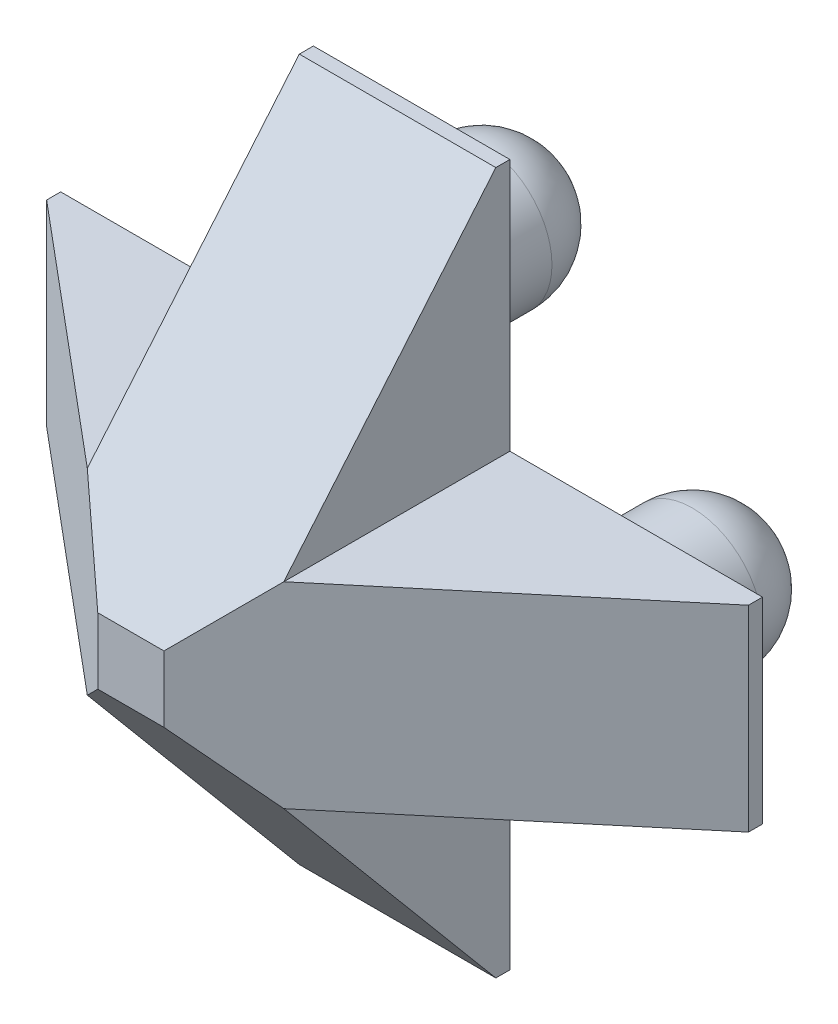
ISO-10303-21;
HEADER;
FILE_DESCRIPTION(('STEP AP214'),'2;1');
FILE_NAME('part.step','',(''),(''),'','','');
FILE_SCHEMA(('AUTOMOTIVE_DESIGN { 1 0 10303 214 1 1 1 1 }'));
ENDSEC;
DATA;
#1=APPLICATION_CONTEXT('core data for automotive mechanical design processes');
#2=APPLICATION_PROTOCOL_DEFINITION('international standard','automotive_design',2000,#1);
#3=PRODUCT_CONTEXT('',#1,'mechanical');
#4=PRODUCT('Part','Part','',(#3));
#5=PRODUCT_RELATED_PRODUCT_CATEGORY('part','',(#4));
#6=PRODUCT_DEFINITION_FORMATION('','',#4);
#7=PRODUCT_DEFINITION_CONTEXT('part definition',#1,'design');
#8=PRODUCT_DEFINITION('design','',#6,#7);
#9=PRODUCT_DEFINITION_SHAPE('','',#8);
#10=(LENGTH_UNIT() NAMED_UNIT(*) SI_UNIT(.MILLI.,.METRE.));
#11=(NAMED_UNIT(*) PLANE_ANGLE_UNIT() SI_UNIT($,.RADIAN.));
#12=(NAMED_UNIT(*) SI_UNIT($,.STERADIAN.) SOLID_ANGLE_UNIT());
#13=UNCERTAINTY_MEASURE_WITH_UNIT(LENGTH_MEASURE(1.E-05),#10,'distance_accuracy_value','');
#14=(GEOMETRIC_REPRESENTATION_CONTEXT(3) GLOBAL_UNCERTAINTY_ASSIGNED_CONTEXT((#13)) GLOBAL_UNIT_ASSIGNED_CONTEXT((#10,
#11,#12)) REPRESENTATION_CONTEXT('',''));
#15=CARTESIAN_POINT('',(0.,0.,0.));
#16=DIRECTION('',(0.,0.,1.));
#17=DIRECTION('',(1.,0.,0.));
#18=AXIS2_PLACEMENT_3D('',#15,#16,#17);
#19=CARTESIAN_POINT('',(22.86,63.5,25.4));
#20=DIRECTION('',(1.,0.,0.));
#21=DIRECTION('',(0.,0.,-1.));
#22=AXIS2_PLACEMENT_3D('',#19,#20,#21);
#23=PLANE('',#22);
#24=DIRECTION('',(0.,0.,-1.));
#25=VECTOR('',#24,1.);
#26=CARTESIAN_POINT('',(22.86,40.64,25.4));
#27=LINE('',#26,#25);
#28=CARTESIAN_POINT('',(22.86,40.64,20.4518175687126));
#29=VERTEX_POINT('',#28);
#30=CARTESIAN_POINT('',(22.86,40.64,0.));
#31=VERTEX_POINT('',#30);
#32=EDGE_CURVE('E143',#29,#31,#27,.T.);
#33=ORIENTED_EDGE('',*,*,#32,.F.);
#34=DIRECTION('',(0.,0.766044443118977,-0.642787609686541));
#35=VECTOR('',#34,1.);
#36=CARTESIAN_POINT('',(22.86,34.7429858107017,25.4));
#37=LINE('',#36,#35);
#38=CARTESIAN_POINT('',(22.86,63.5,1.26999999999992));
#39=VERTEX_POINT('',#38);
#40=EDGE_CURVE('E65',#29,#39,#37,.T.);
#41=ORIENTED_EDGE('',*,*,#40,.T.);
#42=DIRECTION('',(0.,0.,-1.));
#43=VECTOR('',#42,1.);
#44=CARTESIAN_POINT('',(22.86,63.5,25.4));
#45=LINE('',#44,#43);
#46=CARTESIAN_POINT('',(22.86,63.5,0.));
#47=VERTEX_POINT('',#46);
#48=EDGE_CURVE('E166',#39,#47,#45,.T.);
#49=ORIENTED_EDGE('',*,*,#48,.T.);
#50=DIRECTION('',(0.,-1.,0.));
#51=VECTOR('',#50,1.);
#52=CARTESIAN_POINT('',(22.86,63.5,0.));
#53=LINE('',#52,#51);
#54=EDGE_CURVE('E160',#47,#31,#53,.T.);
#55=ORIENTED_EDGE('',*,*,#54,.T.);
#56=EDGE_LOOP('',(#33,#41,#49,#55));
#57=FACE_BOUND('',#56,.T.);
#58=ADVANCED_FACE('F41',(#57),#23,.F.);
#59=CARTESIAN_POINT('',(0.,40.64,25.4));
#60=DIRECTION('',(0.,-1.,0.));
#61=DIRECTION('',(0.,0.,-1.));
#62=AXIS2_PLACEMENT_3D('',#59,#60,#61);
#63=PLANE('',#62);
#64=DIRECTION('',(0.,0.,-1.));
#65=VECTOR('',#64,1.);
#66=CARTESIAN_POINT('',(0.,40.64,25.4));
#67=LINE('',#66,#65);
#68=CARTESIAN_POINT('',(0.,40.64,1.26999999999993));
#69=VERTEX_POINT('',#68);
#70=CARTESIAN_POINT('',(0.,40.64,0.));
#71=VERTEX_POINT('',#70);
#72=EDGE_CURVE('E154',#69,#71,#67,.T.);
#73=ORIENTED_EDGE('',*,*,#72,.F.);
#74=DIRECTION('',(0.766044443118977,0.,0.642787609686541));
#75=VECTOR('',#74,1.);
#76=CARTESIAN_POINT('',(28.7570141892983,40.64,25.4));
#77=LINE('',#76,#75);
#78=EDGE_CURVE('E150',#69,#29,#77,.T.);
#79=ORIENTED_EDGE('',*,*,#78,.T.);
#80=ORIENTED_EDGE('',*,*,#32,.T.);
#81=DIRECTION('',(-1.,0.,0.));
#82=VECTOR('',#81,1.);
#83=CARTESIAN_POINT('',(0.,40.64,0.));
#84=LINE('',#83,#82);
#85=EDGE_CURVE('E147',#31,#71,#84,.T.);
#86=ORIENTED_EDGE('',*,*,#85,.T.);
#87=EDGE_LOOP('',(#73,#79,#80,#86));
#88=FACE_BOUND('',#87,.T.);
#89=ADVANCED_FACE('F146',(#88),#63,.F.);
#90=CARTESIAN_POINT('',(0.,22.86,25.4));
#91=DIRECTION('',(1.,0.,0.));
#92=DIRECTION('',(0.,1.,0.));
#93=AXIS2_PLACEMENT_3D('',#90,#91,#92);
#94=PLANE('',#93);
#95=DIRECTION('',(0.,0.,-1.));
#96=VECTOR('',#95,1.);
#97=CARTESIAN_POINT('',(0.,22.86,25.4));
#98=LINE('',#97,#96);
#99=CARTESIAN_POINT('',(0.,22.86,1.26999999999993));
#100=VERTEX_POINT('',#99);
#101=CARTESIAN_POINT('',(0.,22.86,0.));
#102=VERTEX_POINT('',#101);
#103=EDGE_CURVE('E239',#100,#102,#98,.T.);
#104=ORIENTED_EDGE('',*,*,#103,.F.);
#105=DIRECTION('',(0.,1.,0.));
#106=VECTOR('',#105,1.);
#107=CARTESIAN_POINT('',(0.,40.64,1.26999999999994));
#108=LINE('',#107,#106);
#109=EDGE_CURVE('E278',#100,#69,#108,.T.);
#110=ORIENTED_EDGE('',*,*,#109,.T.);
#111=ORIENTED_EDGE('',*,*,#72,.T.);
#112=DIRECTION('',(0.,-1.,0.));
#113=VECTOR('',#112,1.);
#114=CARTESIAN_POINT('',(0.,22.86,0.));
#115=LINE('',#114,#113);
#116=EDGE_CURVE('E163',#71,#102,#115,.T.);
#117=ORIENTED_EDGE('',*,*,#116,.T.);
#118=EDGE_LOOP('',(#104,#110,#111,#117));
#119=FACE_BOUND('',#118,.T.);
#120=ADVANCED_FACE('F346',(#119),#94,.F.);
#121=CARTESIAN_POINT('',(0.,22.86,25.4));
#122=DIRECTION('',(0.,1.,0.));
#123=DIRECTION('',(0.,0.,1.));
#124=AXIS2_PLACEMENT_3D('',#121,#122,#123);
#125=PLANE('',#124);
#126=DIRECTION('',(0.,0.,-1.));
#127=VECTOR('',#126,1.);
#128=CARTESIAN_POINT('',(22.86,22.86,25.4));
#129=LINE('',#128,#127);
#130=CARTESIAN_POINT('',(22.86,22.86,20.4518175687126));
#131=VERTEX_POINT('',#130);
#132=CARTESIAN_POINT('',(22.86,22.86,0.));
#133=VERTEX_POINT('',#132);
#134=EDGE_CURVE('E236',#131,#133,#129,.T.);
#135=ORIENTED_EDGE('',*,*,#134,.F.);
#136=DIRECTION('',(-0.766044443118977,0.,-0.642787609686541));
#137=VECTOR('',#136,1.);
#138=CARTESIAN_POINT('',(28.7570141892983,22.86,25.4));
#139=LINE('',#138,#137);
#140=EDGE_CURVE('E275',#131,#100,#139,.T.);
#141=ORIENTED_EDGE('',*,*,#140,.T.);
#142=ORIENTED_EDGE('',*,*,#103,.T.);
#143=DIRECTION('',(1.,0.,0.));
#144=VECTOR('',#143,1.);
#145=CARTESIAN_POINT('',(0.,22.86,0.));
#146=LINE('',#145,#144);
#147=EDGE_CURVE('E178',#102,#133,#146,.T.);
#148=ORIENTED_EDGE('',*,*,#147,.T.);
#149=EDGE_LOOP('',(#135,#141,#142,#148));
#150=FACE_BOUND('',#149,.T.);
#151=ADVANCED_FACE('F436',(#150),#125,.F.);
#152=CARTESIAN_POINT('',(22.86,0.,25.4));
#153=DIRECTION('',(1.,0.,0.));
#154=DIRECTION('',(0.,0.,-1.));
#155=AXIS2_PLACEMENT_3D('',#152,#153,#154);
#156=PLANE('',#155);
#157=DIRECTION('',(0.,0.,-1.));
#158=VECTOR('',#157,1.);
#159=CARTESIAN_POINT('',(22.86,0.,25.4));
#160=LINE('',#159,#158);
#161=CARTESIAN_POINT('',(22.86,0.,1.26999999999994));
#162=VERTEX_POINT('',#161);
#163=CARTESIAN_POINT('',(22.86,0.,0.));
#164=VERTEX_POINT('',#163);
#165=EDGE_CURVE('E233',#162,#164,#160,.T.);
#166=ORIENTED_EDGE('',*,*,#165,.F.);
#167=DIRECTION('',(0.,0.766044443118977,0.642787609686541));
#168=VECTOR('',#167,1.);
#169=CARTESIAN_POINT('',(22.86,28.7570141892983,25.4));
#170=LINE('',#169,#168);
#171=EDGE_CURVE('E263',#162,#131,#170,.T.);
#172=ORIENTED_EDGE('',*,*,#171,.T.);
#173=ORIENTED_EDGE('',*,*,#134,.T.);
#174=DIRECTION('',(0.,-1.,0.));
#175=VECTOR('',#174,1.);
#176=CARTESIAN_POINT('',(22.86,0.,0.));
#177=LINE('',#176,#175);
#178=EDGE_CURVE('E182',#133,#164,#177,.T.);
#179=ORIENTED_EDGE('',*,*,#178,.T.);
#180=EDGE_LOOP('',(#166,#172,#173,#179));
#181=FACE_BOUND('',#180,.T.);
#182=ADVANCED_FACE('F432',(#181),#156,.F.);
#183=CARTESIAN_POINT('',(22.86,0.,25.4));
#184=DIRECTION('',(0.,1.,0.));
#185=DIRECTION('',(-1.,0.,0.));
#186=AXIS2_PLACEMENT_3D('',#183,#184,#185);
#187=PLANE('',#186);
#188=DIRECTION('',(0.,0.,-1.));
#189=VECTOR('',#188,1.);
#190=CARTESIAN_POINT('',(40.64,0.,25.4));
#191=LINE('',#190,#189);
#192=CARTESIAN_POINT('',(40.64,0.,1.26999999999994));
#193=VERTEX_POINT('',#192);
#194=CARTESIAN_POINT('',(40.64,0.,0.));
#195=VERTEX_POINT('',#194);
#196=EDGE_CURVE('E230',#193,#195,#191,.T.);
#197=ORIENTED_EDGE('',*,*,#196,.F.);
#198=DIRECTION('',(-1.,0.,0.));
#199=VECTOR('',#198,1.);
#200=CARTESIAN_POINT('',(22.86,0.,1.26999999999994));
#201=LINE('',#200,#199);
#202=EDGE_CURVE('E259',#193,#162,#201,.T.);
#203=ORIENTED_EDGE('',*,*,#202,.T.);
#204=ORIENTED_EDGE('',*,*,#165,.T.);
#205=DIRECTION('',(1.,0.,0.));
#206=VECTOR('',#205,1.);
#207=CARTESIAN_POINT('',(22.86,0.,0.));
#208=LINE('',#207,#206);
#209=EDGE_CURVE('E186',#164,#195,#208,.T.);
#210=ORIENTED_EDGE('',*,*,#209,.T.);
#211=EDGE_LOOP('',(#197,#203,#204,#210));
#212=FACE_BOUND('',#211,.T.);
#213=ADVANCED_FACE('F428',(#212),#187,.F.);
#214=CARTESIAN_POINT('',(40.64,0.,25.4));
#215=DIRECTION('',(-1.,0.,0.));
#216=DIRECTION('',(0.,0.,1.));
#217=AXIS2_PLACEMENT_3D('',#214,#215,#216);
#218=PLANE('',#217);
#219=DIRECTION('',(0.,0.,-1.));
#220=VECTOR('',#219,1.);
#221=CARTESIAN_POINT('',(40.64,22.86,25.4));
#222=LINE('',#221,#220);
#223=CARTESIAN_POINT('',(40.64,22.86,20.4518175687126));
#224=VERTEX_POINT('',#223);
#225=CARTESIAN_POINT('',(40.64,22.86,0.));
#226=VERTEX_POINT('',#225);
#227=EDGE_CURVE('E227',#224,#226,#222,.T.);
#228=ORIENTED_EDGE('',*,*,#227,.F.);
#229=DIRECTION('',(0.,-0.766044443118977,-0.642787609686541));
#230=VECTOR('',#229,1.);
#231=CARTESIAN_POINT('',(40.64,28.7570141892983,25.4));
#232=LINE('',#231,#230);
#233=EDGE_CURVE('E256',#224,#193,#232,.T.);
#234=ORIENTED_EDGE('',*,*,#233,.T.);
#235=ORIENTED_EDGE('',*,*,#196,.T.);
#236=DIRECTION('',(0.,1.,0.));
#237=VECTOR('',#236,1.);
#238=CARTESIAN_POINT('',(40.64,0.,0.));
#239=LINE('',#238,#237);
#240=EDGE_CURVE('E190',#195,#226,#239,.T.);
#241=ORIENTED_EDGE('',*,*,#240,.T.);
#242=EDGE_LOOP('',(#228,#234,#235,#241));
#243=FACE_BOUND('',#242,.T.);
#244=ADVANCED_FACE('F424',(#243),#218,.F.);
#245=CARTESIAN_POINT('',(63.5,22.86,25.4));
#246=DIRECTION('',(0.,1.,0.));
#247=DIRECTION('',(-1.,0.,0.));
#248=AXIS2_PLACEMENT_3D('',#245,#246,#247);
#249=PLANE('',#248);
#250=DIRECTION('',(0.,0.,-1.));
#251=VECTOR('',#250,1.);
#252=CARTESIAN_POINT('',(63.5,22.86,25.4));
#253=LINE('',#252,#251);
#254=CARTESIAN_POINT('',(63.5,22.86,1.26999999999994));
#255=VERTEX_POINT('',#254);
#256=CARTESIAN_POINT('',(63.5,22.86,0.));
#257=VERTEX_POINT('',#256);
#258=EDGE_CURVE('E224',#255,#257,#253,.T.);
#259=ORIENTED_EDGE('',*,*,#258,.F.);
#260=DIRECTION('',(-0.766044443118977,0.,0.642787609686541));
#261=VECTOR('',#260,1.);
#262=CARTESIAN_POINT('',(34.7429858107017,22.86,25.4));
#263=LINE('',#262,#261);
#264=EDGE_CURVE('E272',#255,#224,#263,.T.);
#265=ORIENTED_EDGE('',*,*,#264,.T.);
#266=ORIENTED_EDGE('',*,*,#227,.T.);
#267=DIRECTION('',(1.,0.,0.));
#268=VECTOR('',#267,1.);
#269=CARTESIAN_POINT('',(63.5,22.86,0.));
#270=LINE('',#269,#268);
#271=EDGE_CURVE('E194',#226,#257,#270,.T.);
#272=ORIENTED_EDGE('',*,*,#271,.T.);
#273=EDGE_LOOP('',(#259,#265,#266,#272));
#274=FACE_BOUND('',#273,.T.);
#275=ADVANCED_FACE('F420',(#274),#249,.F.);
#276=CARTESIAN_POINT('',(63.5,22.86,25.4));
#277=DIRECTION('',(-1.,0.,0.));
#278=DIRECTION('',(0.,0.,1.));
#279=AXIS2_PLACEMENT_3D('',#276,#277,#278);
#280=PLANE('',#279);
#281=DIRECTION('',(0.,0.,-1.));
#282=VECTOR('',#281,1.);
#283=CARTESIAN_POINT('',(63.5,40.64,25.4));
#284=LINE('',#283,#282);
#285=CARTESIAN_POINT('',(63.5,40.64,1.26999999999994));
#286=VERTEX_POINT('',#285);
#287=CARTESIAN_POINT('',(63.5,40.64,0.));
#288=VERTEX_POINT('',#287);
#289=EDGE_CURVE('E221',#286,#288,#284,.T.);
#290=ORIENTED_EDGE('',*,*,#289,.F.);
#291=DIRECTION('',(0.,-1.,0.));
#292=VECTOR('',#291,1.);
#293=CARTESIAN_POINT('',(63.5,22.86,1.26999999999994));
#294=LINE('',#293,#292);
#295=EDGE_CURVE('E269',#286,#255,#294,.T.);
#296=ORIENTED_EDGE('',*,*,#295,.T.);
#297=ORIENTED_EDGE('',*,*,#258,.T.);
#298=DIRECTION('',(0.,1.,0.));
#299=VECTOR('',#298,1.);
#300=CARTESIAN_POINT('',(63.5,22.86,0.));
#301=LINE('',#300,#299);
#302=EDGE_CURVE('E198',#257,#288,#301,.T.);
#303=ORIENTED_EDGE('',*,*,#302,.T.);
#304=EDGE_LOOP('',(#290,#296,#297,#303));
#305=FACE_BOUND('',#304,.T.);
#306=ADVANCED_FACE('F416',(#305),#280,.F.);
#307=CARTESIAN_POINT('',(63.5,40.64,25.4));
#308=DIRECTION('',(0.,-1.,0.));
#309=DIRECTION('',(0.,0.,-1.));
#310=AXIS2_PLACEMENT_3D('',#307,#308,#309);
#311=PLANE('',#310);
#312=DIRECTION('',(0.,0.,-1.));
#313=VECTOR('',#312,1.);
#314=CARTESIAN_POINT('',(40.64,40.64,25.4));
#315=LINE('',#314,#313);
#316=CARTESIAN_POINT('',(40.64,40.64,20.4518175687126));
#317=VERTEX_POINT('',#316);
#318=CARTESIAN_POINT('',(40.64,40.64,0.));
#319=VERTEX_POINT('',#318);
#320=EDGE_CURVE('E218',#317,#319,#315,.T.);
#321=ORIENTED_EDGE('',*,*,#320,.F.);
#322=DIRECTION('',(0.766044443118977,0.,-0.642787609686541));
#323=VECTOR('',#322,1.);
#324=CARTESIAN_POINT('',(34.7429858107017,40.64,25.4));
#325=LINE('',#324,#323);
#326=EDGE_CURVE('E266',#317,#286,#325,.T.);
#327=ORIENTED_EDGE('',*,*,#326,.T.);
#328=ORIENTED_EDGE('',*,*,#289,.T.);
#329=DIRECTION('',(-1.,0.,0.));
#330=VECTOR('',#329,1.);
#331=CARTESIAN_POINT('',(63.5,40.64,0.));
#332=LINE('',#331,#330);
#333=EDGE_CURVE('E202',#288,#319,#332,.T.);
#334=ORIENTED_EDGE('',*,*,#333,.T.);
#335=EDGE_LOOP('',(#321,#327,#328,#334));
#336=FACE_BOUND('',#335,.T.);
#337=ADVANCED_FACE('F412',(#336),#311,.F.);
#338=CARTESIAN_POINT('',(40.64,63.5,25.4));
#339=DIRECTION('',(-1.,0.,0.));
#340=DIRECTION('',(0.,0.,1.));
#341=AXIS2_PLACEMENT_3D('',#338,#339,#340);
#342=PLANE('',#341);
#343=DIRECTION('',(0.,0.,-1.));
#344=VECTOR('',#343,1.);
#345=CARTESIAN_POINT('',(40.64,63.5,25.4));
#346=LINE('',#345,#344);
#347=CARTESIAN_POINT('',(40.64,63.5,1.26999999999992));
#348=VERTEX_POINT('',#347);
#349=CARTESIAN_POINT('',(40.64,63.5,0.));
#350=VERTEX_POINT('',#349);
#351=EDGE_CURVE('E215',#348,#350,#346,.T.);
#352=ORIENTED_EDGE('',*,*,#351,.F.);
#353=DIRECTION('',(0.,-0.766044443118977,0.642787609686541));
#354=VECTOR('',#353,1.);
#355=CARTESIAN_POINT('',(40.64,34.7429858107017,25.4));
#356=LINE('',#355,#354);
#357=EDGE_CURVE('E287',#348,#317,#356,.T.);
#358=ORIENTED_EDGE('',*,*,#357,.T.);
#359=ORIENTED_EDGE('',*,*,#320,.T.);
#360=DIRECTION('',(0.,1.,0.));
#361=VECTOR('',#360,1.);
#362=CARTESIAN_POINT('',(40.64,63.5,0.));
#363=LINE('',#362,#361);
#364=EDGE_CURVE('E206',#319,#350,#363,.T.);
#365=ORIENTED_EDGE('',*,*,#364,.T.);
#366=EDGE_LOOP('',(#352,#358,#359,#365));
#367=FACE_BOUND('',#366,.T.);
#368=ADVANCED_FACE('F409',(#367),#342,.F.);
#369=CARTESIAN_POINT('',(22.86,63.5,25.4));
#370=DIRECTION('',(0.,-1.,0.));
#371=DIRECTION('',(0.,0.,-1.));
#372=AXIS2_PLACEMENT_3D('',#369,#370,#371);
#373=PLANE('',#372);
#374=ORIENTED_EDGE('',*,*,#48,.F.);
#375=DIRECTION('',(1.,0.,0.));
#376=VECTOR('',#375,1.);
#377=CARTESIAN_POINT('',(40.64,63.5,1.26999999999993));
#378=LINE('',#377,#376);
#379=EDGE_CURVE('E57',#39,#348,#378,.T.);
#380=ORIENTED_EDGE('',*,*,#379,.T.);
#381=ORIENTED_EDGE('',*,*,#351,.T.);
#382=DIRECTION('',(-1.,0.,0.));
#383=VECTOR('',#382,1.);
#384=CARTESIAN_POINT('',(22.86,63.5,0.));
#385=LINE('',#384,#383);
#386=EDGE_CURVE('E210',#350,#47,#385,.T.);
#387=ORIENTED_EDGE('',*,*,#386,.T.);
#388=EDGE_LOOP('',(#374,#380,#381,#387));
#389=FACE_BOUND('',#388,.T.);
#390=ADVANCED_FACE('F401',(#389),#373,.F.);
#391=CARTESIAN_POINT('',(0.,0.,25.4));
#392=DIRECTION('',(0.,0.,1.));
#393=DIRECTION('',(1.,0.,0.));
#394=AXIS2_PLACEMENT_3D('',#391,#392,#393);
#395=PLANE('',#394);
#396=DIRECTION('',(0.,-1.,0.));
#397=VECTOR('',#396,1.);
#398=CARTESIAN_POINT('',(28.7570141892983,22.86,25.4));
#399=LINE('',#398,#397);
#400=CARTESIAN_POINT('',(28.7570141892983,34.7429858107017,25.4));
#401=VERTEX_POINT('',#400);
#402=CARTESIAN_POINT('',(28.7570141892983,28.7570141892983,25.4));
#403=VERTEX_POINT('',#402);
#404=EDGE_CURVE('E246',#401,#403,#399,.T.);
#405=ORIENTED_EDGE('',*,*,#404,.T.);
#406=DIRECTION('',(1.,0.,0.));
#407=VECTOR('',#406,1.);
#408=CARTESIAN_POINT('',(40.64,28.7570141892983,25.4));
#409=LINE('',#408,#407);
#410=CARTESIAN_POINT('',(34.7429858107017,28.7570141892983,25.4));
#411=VERTEX_POINT('',#410);
#412=EDGE_CURVE('E252',#403,#411,#409,.T.);
#413=ORIENTED_EDGE('',*,*,#412,.T.);
#414=DIRECTION('',(0.,1.,0.));
#415=VECTOR('',#414,1.);
#416=CARTESIAN_POINT('',(34.7429858107017,40.64,25.4));
#417=LINE('',#416,#415);
#418=CARTESIAN_POINT('',(34.7429858107017,34.7429858107017,25.4));
#419=VERTEX_POINT('',#418);
#420=EDGE_CURVE('E249',#411,#419,#417,.T.);
#421=ORIENTED_EDGE('',*,*,#420,.T.);
#422=DIRECTION('',(-1.,0.,0.));
#423=VECTOR('',#422,1.);
#424=CARTESIAN_POINT('',(22.86,34.7429858107017,25.4));
#425=LINE('',#424,#423);
#426=EDGE_CURVE('E153',#419,#401,#425,.T.);
#427=ORIENTED_EDGE('',*,*,#426,.T.);
#428=EDGE_LOOP('',(#405,#413,#421,#427));
#429=FACE_BOUND('',#428,.T.);
#430=ADVANCED_FACE('F395',(#429),#395,.T.);
#431=CARTESIAN_POINT('',(0.,0.,0.));
#432=DIRECTION('',(0.,0.,1.));
#433=DIRECTION('',(1.,0.,0.));
#434=AXIS2_PLACEMENT_3D('',#431,#432,#433);
#435=PLANE('',#434);
#436=CARTESIAN_POINT('',(31.75,50.8,0.));
#437=DIRECTION('',(0.,0.,1.));
#438=DIRECTION('',(1.,0.,0.));
#439=AXIS2_PLACEMENT_3D('',#436,#437,#438);
#440=CIRCLE('',#439,6.35);
#441=CARTESIAN_POINT('',(38.1,50.8,0.));
#442=VERTEX_POINT('',#441);
#443=EDGE_CURVE('E312',#442,#442,#440,.F.);
#444=ORIENTED_EDGE('',*,*,#443,.F.);
#445=EDGE_LOOP('',(#444));
#446=FACE_BOUND('',#445,.T.);
#447=CARTESIAN_POINT('',(31.75,12.7,0.));
#448=DIRECTION('',(0.,0.,1.));
#449=DIRECTION('',(1.,0.,0.));
#450=AXIS2_PLACEMENT_3D('',#447,#448,#449);
#451=CIRCLE('',#450,6.35);
#452=CARTESIAN_POINT('',(38.1,12.7,0.));
#453=VERTEX_POINT('',#452);
#454=EDGE_CURVE('E308',#453,#453,#451,.F.);
#455=ORIENTED_EDGE('',*,*,#454,.F.);
#456=EDGE_LOOP('',(#455));
#457=FACE_BOUND('',#456,.T.);
#458=CARTESIAN_POINT('',(12.7,31.75,0.));
#459=DIRECTION('',(0.,0.,1.));
#460=DIRECTION('',(1.,0.,0.));
#461=AXIS2_PLACEMENT_3D('',#458,#459,#460);
#462=CIRCLE('',#461,6.35);
#463=CARTESIAN_POINT('',(19.05,31.75,0.));
#464=VERTEX_POINT('',#463);
#465=EDGE_CURVE('E304',#464,#464,#462,.F.);
#466=ORIENTED_EDGE('',*,*,#465,.F.);
#467=EDGE_LOOP('',(#466));
#468=FACE_BOUND('',#467,.T.);
#469=CARTESIAN_POINT('',(50.8,31.75,0.));
#470=DIRECTION('',(0.,0.,1.));
#471=DIRECTION('',(1.,0.,0.));
#472=AXIS2_PLACEMENT_3D('',#469,#470,#471);
#473=CIRCLE('',#472,6.35);
#474=CARTESIAN_POINT('',(57.15,31.75,0.));
#475=VERTEX_POINT('',#474);
#476=EDGE_CURVE('E290',#475,#475,#473,.F.);
#477=ORIENTED_EDGE('',*,*,#476,.F.);
#478=EDGE_LOOP('',(#477));
#479=FACE_BOUND('',#478,.T.);
#480=ORIENTED_EDGE('',*,*,#54,.F.);
#481=ORIENTED_EDGE('',*,*,#386,.F.);
#482=ORIENTED_EDGE('',*,*,#364,.F.);
#483=ORIENTED_EDGE('',*,*,#333,.F.);
#484=ORIENTED_EDGE('',*,*,#302,.F.);
#485=ORIENTED_EDGE('',*,*,#271,.F.);
#486=ORIENTED_EDGE('',*,*,#240,.F.);
#487=ORIENTED_EDGE('',*,*,#209,.F.);
#488=ORIENTED_EDGE('',*,*,#178,.F.);
#489=ORIENTED_EDGE('',*,*,#147,.F.);
#490=ORIENTED_EDGE('',*,*,#116,.F.);
#491=ORIENTED_EDGE('',*,*,#85,.F.);
#492=EDGE_LOOP('',(#480,#481,#482,#483,#484,#485,#486,#487,#488,#489,#490,#491));
#493=FACE_BOUND('',#492,.T.);
#494=ADVANCED_FACE('F158',(#446,#457,#468,#479,#493),#435,.F.);
#495=CARTESIAN_POINT('',(0.,34.7429858107017,25.4));
#496=DIRECTION('',(0.,0.642787609686541,0.766044443118977));
#497=DIRECTION('',(1.,0.,0.));
#498=AXIS2_PLACEMENT_3D('',#495,#496,#497);
#499=PLANE('',#498);
#500=ORIENTED_EDGE('',*,*,#379,.F.);
#501=ORIENTED_EDGE('',*,*,#40,.F.);
#502=DIRECTION('',(-0.608120402411342,0.608120402411342,-0.510273605374738));
#503=VECTOR('',#502,1.);
#504=CARTESIAN_POINT('',(41.6053324970365,21.8946675029635,36.1810191532715));
#505=LINE('',#504,#503);
#506=EDGE_CURVE('E169',#401,#29,#505,.T.);
#507=ORIENTED_EDGE('',*,*,#506,.F.);
#508=ORIENTED_EDGE('',*,*,#426,.F.);
#509=DIRECTION('',(0.608120402411343,0.608120402411342,-0.510273605374738));
#510=VECTOR('',#509,1.);
#511=CARTESIAN_POINT('',(21.8946675029635,21.8946675029635,36.1810191532715));
#512=LINE('',#511,#510);
#513=EDGE_CURVE('E173',#317,#419,#512,.F.);
#514=ORIENTED_EDGE('',*,*,#513,.F.);
#515=ORIENTED_EDGE('',*,*,#357,.F.);
#516=EDGE_LOOP('',(#500,#501,#507,#508,#514,#515));
#517=FACE_BOUND('',#516,.T.);
#518=ADVANCED_FACE('F372',(#517),#499,.T.);
#519=CARTESIAN_POINT('',(28.7570141892983,0.,25.4));
#520=DIRECTION('',(-0.64278760968654,0.,0.766044443118977));
#521=DIRECTION('',(0.,1.,0.));
#522=AXIS2_PLACEMENT_3D('',#519,#520,#521);
#523=PLANE('',#522);
#524=ORIENTED_EDGE('',*,*,#109,.F.);
#525=ORIENTED_EDGE('',*,*,#140,.F.);
#526=DIRECTION('',(-0.608120402411342,-0.608120402411342,-0.510273605374738));
#527=VECTOR('',#526,1.);
#528=CARTESIAN_POINT('',(18.1223705838992,18.1223705838992,16.4764744730078));
#529=LINE('',#528,#527);
#530=EDGE_CURVE('E294',#403,#131,#529,.T.);
#531=ORIENTED_EDGE('',*,*,#530,.F.);
#532=ORIENTED_EDGE('',*,*,#404,.F.);
#533=ORIENTED_EDGE('',*,*,#506,.T.);
#534=ORIENTED_EDGE('',*,*,#78,.F.);
#535=EDGE_LOOP('',(#524,#525,#531,#532,#533,#534));
#536=FACE_BOUND('',#535,.T.);
#537=ADVANCED_FACE('F365',(#536),#523,.T.);
#538=CARTESIAN_POINT('',(34.7429858107017,0.,25.4));
#539=DIRECTION('',(0.64278760968654,0.,0.766044443118977));
#540=DIRECTION('',(0.,-1.,0.));
#541=AXIS2_PLACEMENT_3D('',#538,#539,#540);
#542=PLANE('',#541);
#543=ORIENTED_EDGE('',*,*,#513,.T.);
#544=ORIENTED_EDGE('',*,*,#420,.F.);
#545=DIRECTION('',(0.608120402411342,-0.608120402411342,-0.510273605374738));
#546=VECTOR('',#545,1.);
#547=CARTESIAN_POINT('',(45.3776294161008,18.1223705838992,16.4764744730078));
#548=LINE('',#547,#546);
#549=EDGE_CURVE('E291',#224,#411,#548,.F.);
#550=ORIENTED_EDGE('',*,*,#549,.F.);
#551=ORIENTED_EDGE('',*,*,#264,.F.);
#552=ORIENTED_EDGE('',*,*,#295,.F.);
#553=ORIENTED_EDGE('',*,*,#326,.F.);
#554=EDGE_LOOP('',(#543,#544,#550,#551,#552,#553));
#555=FACE_BOUND('',#554,.T.);
#556=ADVANCED_FACE('F358',(#555),#542,.T.);
#557=CARTESIAN_POINT('',(0.,28.7570141892983,25.4));
#558=DIRECTION('',(0.,-0.64278760968654,0.766044443118977));
#559=DIRECTION('',(-1.,0.,0.));
#560=AXIS2_PLACEMENT_3D('',#557,#558,#559);
#561=PLANE('',#560);
#562=ORIENTED_EDGE('',*,*,#171,.F.);
#563=ORIENTED_EDGE('',*,*,#202,.F.);
#564=ORIENTED_EDGE('',*,*,#233,.F.);
#565=ORIENTED_EDGE('',*,*,#549,.T.);
#566=ORIENTED_EDGE('',*,*,#412,.F.);
#567=ORIENTED_EDGE('',*,*,#530,.T.);
#568=EDGE_LOOP('',(#562,#563,#564,#565,#566,#567));
#569=FACE_BOUND('',#568,.T.);
#570=ADVANCED_FACE('F351',(#569),#561,.T.);
#571=CARTESIAN_POINT('',(50.8,31.75,-12.7));
#572=DIRECTION('',(0.,0.,1.));
#573=DIRECTION('',(1.,0.,0.));
#574=AXIS2_PLACEMENT_3D('',#571,#572,#573);
#575=CYLINDRICAL_SURFACE('',#574,6.35);
#576=CARTESIAN_POINT('',(50.8,31.75,-6.35));
#577=DIRECTION('',(0.,0.,1.));
#578=DIRECTION('',(1.,0.,0.));
#579=AXIS2_PLACEMENT_3D('',#576,#577,#578);
#580=CIRCLE('',#579,6.35);
#581=CARTESIAN_POINT('',(57.15,31.75,-6.35));
#582=VERTEX_POINT('',#581);
#583=EDGE_CURVE('E316',#582,#582,#580,.T.);
#584=ORIENTED_EDGE('',*,*,#583,.T.);
#585=EDGE_LOOP('',(#584));
#586=FACE_BOUND('',#585,.T.);
#587=ORIENTED_EDGE('',*,*,#476,.T.);
#588=EDGE_LOOP('',(#587));
#589=FACE_BOUND('',#588,.T.);
#590=ADVANCED_FACE('F357',(#586,#589),#575,.T.);
#591=CARTESIAN_POINT('',(12.7,31.75,-12.7));
#592=DIRECTION('',(0.,0.,1.));
#593=DIRECTION('',(1.,0.,0.));
#594=AXIS2_PLACEMENT_3D('',#591,#592,#593);
#595=CYLINDRICAL_SURFACE('',#594,6.35);
#596=CARTESIAN_POINT('',(12.7,31.75,-6.35));
#597=DIRECTION('',(0.,0.,1.));
#598=DIRECTION('',(1.,0.,0.));
#599=AXIS2_PLACEMENT_3D('',#596,#597,#598);
#600=CIRCLE('',#599,6.35);
#601=CARTESIAN_POINT('',(19.05,31.75,-6.35));
#602=VERTEX_POINT('',#601);
#603=EDGE_CURVE('E11',#602,#602,#600,.T.);
#604=ORIENTED_EDGE('',*,*,#603,.T.);
#605=EDGE_LOOP('',(#604));
#606=FACE_BOUND('',#605,.T.);
#607=ORIENTED_EDGE('',*,*,#465,.T.);
#608=EDGE_LOOP('',(#607));
#609=FACE_BOUND('',#608,.T.);
#610=ADVANCED_FACE('F390',(#606,#609),#595,.T.);
#611=CARTESIAN_POINT('',(31.75,12.7,-12.7));
#612=DIRECTION('',(0.,0.,1.));
#613=DIRECTION('',(1.,0.,0.));
#614=AXIS2_PLACEMENT_3D('',#611,#612,#613);
#615=CYLINDRICAL_SURFACE('',#614,6.35);
#616=CARTESIAN_POINT('',(31.75,12.7,-6.35));
#617=DIRECTION('',(0.,0.,1.));
#618=DIRECTION('',(1.,0.,0.));
#619=AXIS2_PLACEMENT_3D('',#616,#617,#618);
#620=CIRCLE('',#619,6.35);
#621=CARTESIAN_POINT('',(38.1,12.7,-6.35));
#622=VERTEX_POINT('',#621);
#623=EDGE_CURVE('E320',#622,#622,#620,.T.);
#624=ORIENTED_EDGE('',*,*,#623,.T.);
#625=EDGE_LOOP('',(#624));
#626=FACE_BOUND('',#625,.T.);
#627=ORIENTED_EDGE('',*,*,#454,.T.);
#628=EDGE_LOOP('',(#627));
#629=FACE_BOUND('',#628,.T.);
#630=ADVANCED_FACE('F384',(#626,#629),#615,.T.);
#631=CARTESIAN_POINT('',(31.75,50.8,-12.7));
#632=DIRECTION('',(0.,0.,1.));
#633=DIRECTION('',(1.,0.,0.));
#634=AXIS2_PLACEMENT_3D('',#631,#632,#633);
#635=CYLINDRICAL_SURFACE('',#634,6.35);
#636=CARTESIAN_POINT('',(31.75,50.8,-6.35));
#637=DIRECTION('',(0.,0.,1.));
#638=DIRECTION('',(1.,0.,0.));
#639=AXIS2_PLACEMENT_3D('',#636,#637,#638);
#640=CIRCLE('',#639,6.35);
#641=CARTESIAN_POINT('',(38.1,50.8,-6.35));
#642=VERTEX_POINT('',#641);
#643=EDGE_CURVE('E50',#642,#642,#640,.T.);
#644=ORIENTED_EDGE('',*,*,#643,.T.);
#645=EDGE_LOOP('',(#644));
#646=FACE_BOUND('',#645,.T.);
#647=ORIENTED_EDGE('',*,*,#443,.T.);
#648=EDGE_LOOP('',(#647));
#649=FACE_BOUND('',#648,.T.);
#650=ADVANCED_FACE('F327',(#646,#649),#635,.T.);
#651=CARTESIAN_POINT('',(50.8,31.75,-6.35));
#652=DIRECTION('',(0.,0.,-1.));
#653=DIRECTION('',(-1.,0.,0.));
#654=AXIS2_PLACEMENT_3D('',#651,#652,#653);
#655=SPHERICAL_SURFACE('',#654,6.35);
#656=ORIENTED_EDGE('',*,*,#583,.F.);
#657=EDGE_LOOP('',(#656));
#658=FACE_BOUND('',#657,.T.);
#659=ADVANCED_FACE('F338',(#658),#655,.T.);
#660=CARTESIAN_POINT('',(31.75,12.7,-6.35));
#661=DIRECTION('',(0.,0.,-1.));
#662=DIRECTION('',(-1.,0.,0.));
#663=AXIS2_PLACEMENT_3D('',#660,#661,#662);
#664=SPHERICAL_SURFACE('',#663,6.35);
#665=ORIENTED_EDGE('',*,*,#623,.F.);
#666=EDGE_LOOP('',(#665));
#667=FACE_BOUND('',#666,.T.);
#668=ADVANCED_FACE('F332',(#667),#664,.T.);
#669=CARTESIAN_POINT('',(31.75,50.8,-6.35));
#670=DIRECTION('',(0.,0.,-1.));
#671=DIRECTION('',(-1.,0.,0.));
#672=AXIS2_PLACEMENT_3D('',#669,#670,#671);
#673=SPHERICAL_SURFACE('',#672,6.35);
#674=ORIENTED_EDGE('',*,*,#643,.F.);
#675=EDGE_LOOP('',(#674));
#676=FACE_BOUND('',#675,.T.);
#677=ADVANCED_FACE('F330',(#676),#673,.T.);
#678=CARTESIAN_POINT('',(12.7,31.75,-6.35));
#679=DIRECTION('',(0.,0.,-1.));
#680=DIRECTION('',(-1.,0.,0.));
#681=AXIS2_PLACEMENT_3D('',#678,#679,#680);
#682=SPHERICAL_SURFACE('',#681,6.35);
#683=ORIENTED_EDGE('',*,*,#603,.F.);
#684=EDGE_LOOP('',(#683));
#685=FACE_BOUND('',#684,.T.);
#686=ADVANCED_FACE('F43',(#685),#682,.T.);
#687=CLOSED_SHELL('',(#58,#89,#120,#151,#182,#213,#244,#275,#306,#337,#368,#390,#430,#494,#518,
#537,#556,#570,#590,#610,#630,#650,#659,#668,#677,#686));
#688=MANIFOLD_SOLID_BREP('B2',#687);
#689=ADVANCED_BREP_SHAPE_REPRESENTATION('',(#18,#688),#14);
#690=SHAPE_DEFINITION_REPRESENTATION(#9,#689);
ENDSEC;
END-ISO-10303-21;
